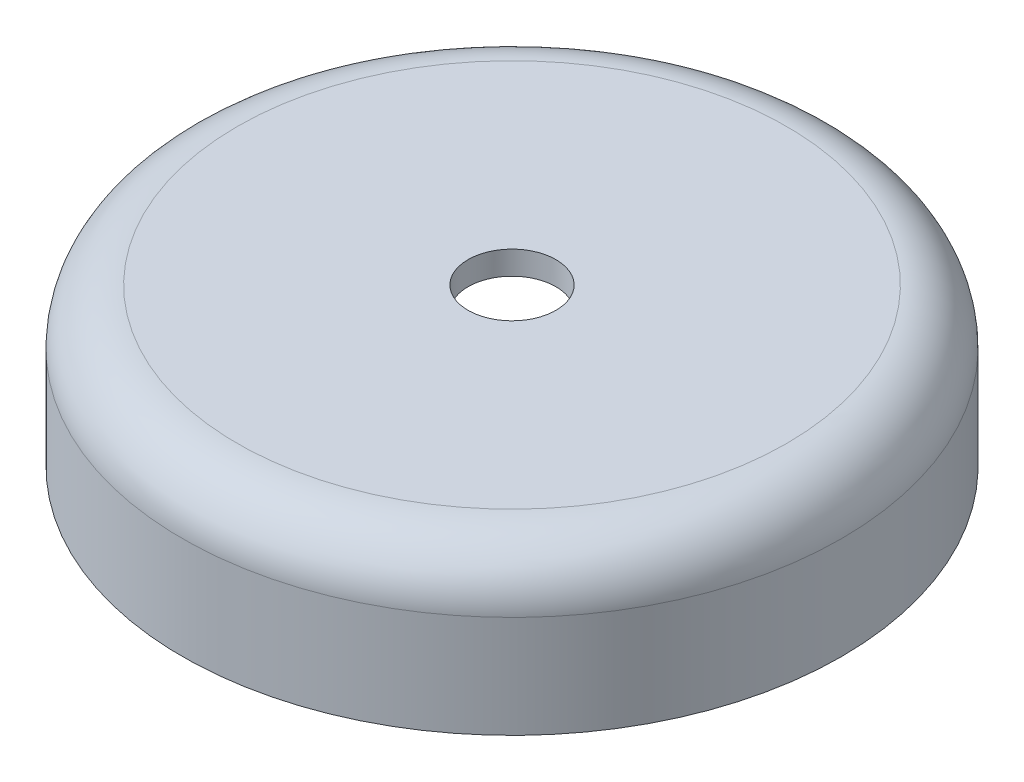
ISO-10303-21;
HEADER;
FILE_DESCRIPTION(('STEP AP214'),'2;1');
FILE_NAME('part.step','',(''),(''),'','','');
FILE_SCHEMA(('AUTOMOTIVE_DESIGN { 1 0 10303 214 1 1 1 1 }'));
ENDSEC;
DATA;
#1=APPLICATION_CONTEXT('core data for automotive mechanical design processes');
#2=APPLICATION_PROTOCOL_DEFINITION('international standard','automotive_design',2000,#1);
#3=PRODUCT_CONTEXT('',#1,'mechanical');
#4=PRODUCT('Part','Part','',(#3));
#5=PRODUCT_RELATED_PRODUCT_CATEGORY('part','',(#4));
#6=PRODUCT_DEFINITION_FORMATION('','',#4);
#7=PRODUCT_DEFINITION_CONTEXT('part definition',#1,'design');
#8=PRODUCT_DEFINITION('design','',#6,#7);
#9=PRODUCT_DEFINITION_SHAPE('','',#8);
#10=(LENGTH_UNIT() NAMED_UNIT(*) SI_UNIT(.MILLI.,.METRE.));
#11=(NAMED_UNIT(*) PLANE_ANGLE_UNIT() SI_UNIT($,.RADIAN.));
#12=(NAMED_UNIT(*) SI_UNIT($,.STERADIAN.) SOLID_ANGLE_UNIT());
#13=UNCERTAINTY_MEASURE_WITH_UNIT(LENGTH_MEASURE(1.E-05),#10,'distance_accuracy_value','');
#14=(GEOMETRIC_REPRESENTATION_CONTEXT(3) GLOBAL_UNCERTAINTY_ASSIGNED_CONTEXT((#13)) GLOBAL_UNIT_ASSIGNED_CONTEXT((#10,
#11,#12)) REPRESENTATION_CONTEXT('',''));
#15=CARTESIAN_POINT('',(0.,0.,0.));
#16=DIRECTION('',(0.,0.,1.));
#17=DIRECTION('',(1.,0.,0.));
#18=AXIS2_PLACEMENT_3D('',#15,#16,#17);
#19=CARTESIAN_POINT('',(0.,-2.14,0.));
#20=DIRECTION('',(0.,-1.,0.));
#21=DIRECTION('',(1.,0.,0.));
#22=AXIS2_PLACEMENT_3D('',#19,#20,#21);
#23=PLANE('',#22);
#24=CARTESIAN_POINT('',(0.,-2.14,0.));
#25=DIRECTION('',(0.,-1.,0.));
#26=DIRECTION('',(1.,0.,0.));
#27=AXIS2_PLACEMENT_3D('',#24,#25,#26);
#28=CIRCLE('',#27,4.);
#29=CARTESIAN_POINT('',(4.,-2.14,0.));
#30=VERTEX_POINT('',#29);
#31=EDGE_CURVE('E55',#30,#30,#28,.F.);
#32=ORIENTED_EDGE('',*,*,#31,.T.);
#33=EDGE_LOOP('',(#32));
#34=FACE_BOUND('',#33,.T.);
#35=CARTESIAN_POINT('',(0.,-2.14,0.));
#36=DIRECTION('',(0.,1.,0.));
#37=DIRECTION('',(-1.,0.,0.));
#38=AXIS2_PLACEMENT_3D('',#35,#36,#37);
#39=CIRCLE('',#38,23.86);
#40=CARTESIAN_POINT('',(-23.86,-2.14,0.));
#41=VERTEX_POINT('',#40);
#42=EDGE_CURVE('E10',#41,#41,#39,.T.);
#43=ORIENTED_EDGE('',*,*,#42,.F.);
#44=EDGE_LOOP('',(#43));
#45=FACE_BOUND('',#44,.T.);
#46=ADVANCED_FACE('F29',(#34,#45),#23,.T.);
#47=CARTESIAN_POINT('',(0.,-6.14,0.));
#48=DIRECTION('',(0.,1.,0.));
#49=DIRECTION('',(-1.,0.,0.));
#50=AXIS2_PLACEMENT_3D('',#47,#48,#49);
#51=TOROIDAL_SURFACE('',#50,23.86,4.);
#52=ORIENTED_EDGE('',*,*,#42,.T.);
#53=EDGE_LOOP('',(#52));
#54=FACE_BOUND('',#53,.T.);
#55=CARTESIAN_POINT('',(0.,-6.14,0.));
#56=DIRECTION('',(0.,1.,0.));
#57=DIRECTION('',(-1.,0.,0.));
#58=AXIS2_PLACEMENT_3D('',#55,#56,#57);
#59=CIRCLE('',#58,27.86);
#60=CARTESIAN_POINT('',(-27.86,-6.14,0.));
#61=VERTEX_POINT('',#60);
#62=EDGE_CURVE('E35',#61,#61,#59,.T.);
#63=ORIENTED_EDGE('',*,*,#62,.F.);
#64=EDGE_LOOP('',(#63));
#65=FACE_BOUND('',#64,.T.);
#66=ADVANCED_FACE('F81',(#54,#65),#51,.F.);
#67=CARTESIAN_POINT('',(0.,0.,0.));
#68=DIRECTION('',(0.,1.,0.));
#69=DIRECTION('',(-1.,0.,0.));
#70=AXIS2_PLACEMENT_3D('',#67,#68,#69);
#71=CYLINDRICAL_SURFACE('',#70,27.86);
#72=ORIENTED_EDGE('',*,*,#62,.T.);
#73=EDGE_LOOP('',(#72));
#74=FACE_BOUND('',#73,.T.);
#75=CARTESIAN_POINT('',(0.,-14.3,0.));
#76=DIRECTION('',(0.,1.,0.));
#77=DIRECTION('',(-1.,0.,0.));
#78=AXIS2_PLACEMENT_3D('',#75,#76,#77);
#79=CIRCLE('',#78,27.86);
#80=CARTESIAN_POINT('',(-27.86,-14.3,0.));
#81=VERTEX_POINT('',#80);
#82=EDGE_CURVE('E39',#81,#81,#79,.T.);
#83=ORIENTED_EDGE('',*,*,#82,.F.);
#84=EDGE_LOOP('',(#83));
#85=FACE_BOUND('',#84,.T.);
#86=ADVANCED_FACE('F86',(#74,#85),#71,.F.);
#87=CARTESIAN_POINT('',(-30.,-14.3,0.));
#88=DIRECTION('',(0.,-1.,0.));
#89=DIRECTION('',(1.,0.,0.));
#90=AXIS2_PLACEMENT_3D('',#87,#88,#89);
#91=PLANE('',#90);
#92=ORIENTED_EDGE('',*,*,#82,.T.);
#93=EDGE_LOOP('',(#92));
#94=FACE_BOUND('',#93,.T.);
#95=CARTESIAN_POINT('',(0.,-14.3,0.));
#96=DIRECTION('',(0.,1.,0.));
#97=DIRECTION('',(-1.,0.,0.));
#98=AXIS2_PLACEMENT_3D('',#95,#96,#97);
#99=CIRCLE('',#98,30.);
#100=CARTESIAN_POINT('',(-30.,-14.3,0.));
#101=VERTEX_POINT('',#100);
#102=EDGE_CURVE('E43',#101,#101,#99,.T.);
#103=ORIENTED_EDGE('',*,*,#102,.F.);
#104=EDGE_LOOP('',(#103));
#105=FACE_BOUND('',#104,.T.);
#106=ADVANCED_FACE('F77',(#94,#105),#91,.T.);
#107=CARTESIAN_POINT('',(0.,0.,0.));
#108=DIRECTION('',(0.,1.,0.));
#109=DIRECTION('',(-1.,0.,0.));
#110=AXIS2_PLACEMENT_3D('',#107,#108,#109);
#111=CYLINDRICAL_SURFACE('',#110,30.);
#112=ORIENTED_EDGE('',*,*,#102,.T.);
#113=EDGE_LOOP('',(#112));
#114=FACE_BOUND('',#113,.T.);
#115=CARTESIAN_POINT('',(0.,-5.00000000000003,0.));
#116=DIRECTION('',(0.,1.,0.));
#117=DIRECTION('',(-1.,0.,0.));
#118=AXIS2_PLACEMENT_3D('',#115,#116,#117);
#119=CIRCLE('',#118,30.);
#120=CARTESIAN_POINT('',(-30.,-5.00000000000004,0.));
#121=VERTEX_POINT('',#120);
#122=EDGE_CURVE('E48',#121,#121,#119,.T.);
#123=ORIENTED_EDGE('',*,*,#122,.F.);
#124=EDGE_LOOP('',(#123));
#125=FACE_BOUND('',#124,.T.);
#126=ADVANCED_FACE('F71',(#114,#125),#111,.T.);
#127=CARTESIAN_POINT('',(0.,-5.,0.));
#128=DIRECTION('',(0.,1.,0.));
#129=DIRECTION('',(-1.,0.,0.));
#130=AXIS2_PLACEMENT_3D('',#127,#128,#129);
#131=TOROIDAL_SURFACE('',#130,25.,5.);
#132=ORIENTED_EDGE('',*,*,#122,.T.);
#133=EDGE_LOOP('',(#132));
#134=FACE_BOUND('',#133,.T.);
#135=CARTESIAN_POINT('',(0.,0.,0.));
#136=DIRECTION('',(0.,1.,0.));
#137=DIRECTION('',(-1.,0.,0.));
#138=AXIS2_PLACEMENT_3D('',#135,#136,#137);
#139=CIRCLE('',#138,25.);
#140=CARTESIAN_POINT('',(-25.,0.,0.));
#141=VERTEX_POINT('',#140);
#142=EDGE_CURVE('E51',#141,#141,#139,.T.);
#143=ORIENTED_EDGE('',*,*,#142,.F.);
#144=EDGE_LOOP('',(#143));
#145=FACE_BOUND('',#144,.T.);
#146=ADVANCED_FACE('F66',(#134,#145),#131,.T.);
#147=CARTESIAN_POINT('',(0.,0.,0.));
#148=DIRECTION('',(0.,1.,0.));
#149=DIRECTION('',(-1.,0.,0.));
#150=AXIS2_PLACEMENT_3D('',#147,#148,#149);
#151=PLANE('',#150);
#152=CARTESIAN_POINT('',(0.,0.,0.));
#153=DIRECTION('',(0.,1.,0.));
#154=DIRECTION('',(-1.,0.,0.));
#155=AXIS2_PLACEMENT_3D('',#152,#153,#154);
#156=CIRCLE('',#155,4.);
#157=CARTESIAN_POINT('',(-4.,0.,0.));
#158=VERTEX_POINT('',#157);
#159=EDGE_CURVE('E54',#158,#158,#156,.T.);
#160=ORIENTED_EDGE('',*,*,#159,.F.);
#161=EDGE_LOOP('',(#160));
#162=FACE_BOUND('',#161,.T.);
#163=ORIENTED_EDGE('',*,*,#142,.T.);
#164=EDGE_LOOP('',(#163));
#165=FACE_BOUND('',#164,.T.);
#166=ADVANCED_FACE('F63',(#162,#165),#151,.T.);
#167=CARTESIAN_POINT('',(0.,-14.301,0.));
#168=DIRECTION('',(0.,1.,0.));
#169=DIRECTION('',(-1.,0.,0.));
#170=AXIS2_PLACEMENT_3D('',#167,#168,#169);
#171=CYLINDRICAL_SURFACE('',#170,4.);
#172=ORIENTED_EDGE('',*,*,#31,.F.);
#173=EDGE_LOOP('',(#172));
#174=FACE_BOUND('',#173,.T.);
#175=ORIENTED_EDGE('',*,*,#159,.T.);
#176=EDGE_LOOP('',(#175));
#177=FACE_BOUND('',#176,.T.);
#178=ADVANCED_FACE('F61',(#174,#177),#171,.F.);
#179=CLOSED_SHELL('',(#46,#66,#86,#106,#126,#146,#166,#178));
#180=MANIFOLD_SOLID_BREP('B2',#179);
#181=ADVANCED_BREP_SHAPE_REPRESENTATION('',(#18,#180),#14);
#182=SHAPE_DEFINITION_REPRESENTATION(#9,#181);
ENDSEC;
END-ISO-10303-21;
